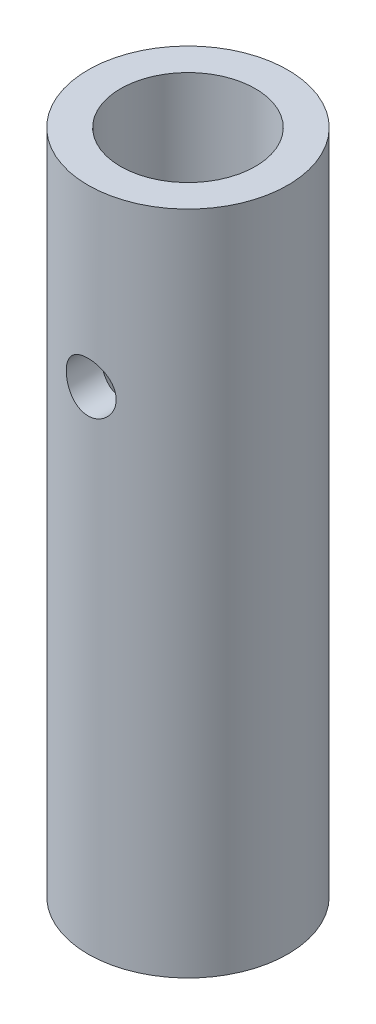
ISO-10303-21;
HEADER;
FILE_DESCRIPTION(('STEP AP214'),'2;1');
FILE_NAME('part.step','',(''),(''),'','','');
FILE_SCHEMA(('AUTOMOTIVE_DESIGN { 1 0 10303 214 1 1 1 1 }'));
ENDSEC;
DATA;
#1=APPLICATION_CONTEXT('core data for automotive mechanical design processes');
#2=APPLICATION_PROTOCOL_DEFINITION('international standard','automotive_design',2000,#1);
#3=PRODUCT_CONTEXT('',#1,'mechanical');
#4=PRODUCT('Part','Part','',(#3));
#5=PRODUCT_RELATED_PRODUCT_CATEGORY('part','',(#4));
#6=PRODUCT_DEFINITION_FORMATION('','',#4);
#7=PRODUCT_DEFINITION_CONTEXT('part definition',#1,'design');
#8=PRODUCT_DEFINITION('design','',#6,#7);
#9=PRODUCT_DEFINITION_SHAPE('','',#8);
#10=(LENGTH_UNIT() NAMED_UNIT(*) SI_UNIT(.MILLI.,.METRE.));
#11=(NAMED_UNIT(*) PLANE_ANGLE_UNIT() SI_UNIT($,.RADIAN.));
#12=(NAMED_UNIT(*) SI_UNIT($,.STERADIAN.) SOLID_ANGLE_UNIT());
#13=UNCERTAINTY_MEASURE_WITH_UNIT(LENGTH_MEASURE(1.E-05),#10,'distance_accuracy_value','');
#14=(GEOMETRIC_REPRESENTATION_CONTEXT(3) GLOBAL_UNCERTAINTY_ASSIGNED_CONTEXT((#13)) GLOBAL_UNIT_ASSIGNED_CONTEXT((#10,
#11,#12)) REPRESENTATION_CONTEXT('',''));
#15=CARTESIAN_POINT('',(0.,0.,0.));
#16=DIRECTION('',(0.,0.,1.));
#17=DIRECTION('',(1.,0.,0.));
#18=AXIS2_PLACEMENT_3D('',#15,#16,#17);
#19=CARTESIAN_POINT('',(0.,40.,0.));
#20=DIRECTION('',(0.,1.,0.));
#21=DIRECTION('',(0.,0.,1.));
#22=AXIS2_PLACEMENT_3D('',#19,#20,#21);
#23=PLANE('',#22);
#24=CARTESIAN_POINT('',(0.,40.,0.));
#25=DIRECTION('',(0.,1.,0.));
#26=DIRECTION('',(0.,0.,1.));
#27=AXIS2_PLACEMENT_3D('',#24,#25,#26);
#28=CIRCLE('',#27,6.);
#29=CARTESIAN_POINT('',(0.,40.,6.));
#30=VERTEX_POINT('',#29);
#31=EDGE_CURVE('E10',#30,#30,#28,.T.);
#32=ORIENTED_EDGE('',*,*,#31,.T.);
#33=EDGE_LOOP('',(#32));
#34=FACE_BOUND('',#33,.T.);
#35=CARTESIAN_POINT('',(0.,40.,0.));
#36=DIRECTION('',(0.,1.,0.));
#37=DIRECTION('',(0.,0.,1.));
#38=AXIS2_PLACEMENT_3D('',#35,#36,#37);
#39=CIRCLE('',#38,4.05);
#40=CARTESIAN_POINT('',(0.,40.,4.05));
#41=VERTEX_POINT('',#40);
#42=EDGE_CURVE('E64',#41,#41,#39,.T.);
#43=ORIENTED_EDGE('',*,*,#42,.F.);
#44=EDGE_LOOP('',(#43));
#45=FACE_BOUND('',#44,.T.);
#46=ADVANCED_FACE('F43',(#34,#45),#23,.T.);
#47=CARTESIAN_POINT('',(0.,0.,0.));
#48=DIRECTION('',(0.,1.,0.));
#49=DIRECTION('',(0.,0.,1.));
#50=AXIS2_PLACEMENT_3D('',#47,#48,#49);
#51=PLANE('',#50);
#52=CARTESIAN_POINT('',(0.,0.,0.));
#53=DIRECTION('',(0.,1.,0.));
#54=DIRECTION('',(0.,0.,1.));
#55=AXIS2_PLACEMENT_3D('',#52,#53,#54);
#56=CIRCLE('',#55,6.);
#57=CARTESIAN_POINT('',(0.,0.,6.));
#58=VERTEX_POINT('',#57);
#59=EDGE_CURVE('E58',#58,#58,#56,.T.);
#60=ORIENTED_EDGE('',*,*,#59,.F.);
#61=EDGE_LOOP('',(#60));
#62=FACE_BOUND('',#61,.T.);
#63=CARTESIAN_POINT('',(0.,0.,0.));
#64=DIRECTION('',(0.,1.,0.));
#65=DIRECTION('',(0.,0.,1.));
#66=AXIS2_PLACEMENT_3D('',#63,#64,#65);
#67=CIRCLE('',#66,4.05);
#68=CARTESIAN_POINT('',(0.,0.,4.05));
#69=VERTEX_POINT('',#68);
#70=EDGE_CURVE('E67',#69,#69,#67,.T.);
#71=ORIENTED_EDGE('',*,*,#70,.T.);
#72=EDGE_LOOP('',(#71));
#73=FACE_BOUND('',#72,.T.);
#74=ADVANCED_FACE('F108',(#62,#73),#51,.F.);
#75=CARTESIAN_POINT('',(0.,40.,0.));
#76=DIRECTION('',(0.,-1.,0.));
#77=DIRECTION('',(0.,0.,-1.));
#78=AXIS2_PLACEMENT_3D('',#75,#76,#77);
#79=CYLINDRICAL_SURFACE('',#78,6.);
#80=CARTESIAN_POINT('',(0.,31.,-6.));
#81=CARTESIAN_POINT('',(-0.0828760886697308,30.9999976742618,-5.99999859868013));
#82=CARTESIAN_POINT('',(-0.165778157830763,30.9931084492262,-5.99826578131828));
#83=CARTESIAN_POINT('',(-0.329206323770532,30.965774848693,-5.99152113829892));
#84=CARTESIAN_POINT('',(-0.409731046870739,30.9453227904621,-5.98650745419968));
#85=CARTESIAN_POINT('',(-0.566020872182577,30.8915607465379,-5.9737562633204));
#86=CARTESIAN_POINT('',(-0.641791563430002,30.8582662012847,-5.96602202842087));
#87=CARTESIAN_POINT('',(-0.786672131904425,30.7798186099552,-5.94865343807593));
#88=CARTESIAN_POINT('',(-0.855781784348758,30.7346651638811,-5.9390190185405));
#89=CARTESIAN_POINT('',(-0.986801927300919,30.6327992103458,-5.91867413591801));
#90=CARTESIAN_POINT('',(-1.04855569006107,30.5758884250408,-5.90794707148533));
#91=CARTESIAN_POINT('',(-1.1617489272033,30.4525477950911,-5.8867362011753));
#92=CARTESIAN_POINT('',(-1.21318723694913,30.3861168770535,-5.87625242288348));
#93=CARTESIAN_POINT('',(-1.30502654279903,30.2444047732626,-5.8565477569971));
#94=CARTESIAN_POINT('',(-1.34525221592536,30.1690067691896,-5.84734794470605));
#95=CARTESIAN_POINT('',(-1.41239690855053,30.0122515883416,-5.83149494812223));
#96=CARTESIAN_POINT('',(-1.43931805543933,29.9308953666742,-5.82484135672789));
#97=CARTESIAN_POINT('',(-1.47855483680429,29.7662565017975,-5.81500476717551));
#98=CARTESIAN_POINT('',(-1.49115226833334,29.6830451039502,-5.81175491075426));
#99=CARTESIAN_POINT('',(-1.50226177506785,29.515631430986,-5.80889362537741));
#100=CARTESIAN_POINT('',(-1.50077614181798,29.4314293193014,-5.80928160448644));
#101=CARTESIAN_POINT('',(-1.48398652463928,29.2665841922555,-5.81359205496618));
#102=CARTESIAN_POINT('',(-1.46901834019052,29.1859043785349,-5.81742863001879));
#103=CARTESIAN_POINT('',(-1.42622418690311,29.0282389490887,-5.82806709676484));
#104=CARTESIAN_POINT('',(-1.39839730206942,28.951253596971,-5.83486919970697));
#105=CARTESIAN_POINT('',(-1.33038947793715,28.8022619837479,-5.85075113904187));
#106=CARTESIAN_POINT('',(-1.29008666723291,28.7303138282104,-5.85985327469421));
#107=CARTESIAN_POINT('',(-1.19835627601495,28.5940812902432,-5.87929710846386));
#108=CARTESIAN_POINT('',(-1.14692674880884,28.5297982519327,-5.88963902334735));
#109=CARTESIAN_POINT('',(-1.03266342468122,28.4087963843056,-5.91075880539781));
#110=CARTESIAN_POINT('',(-0.969546258165858,28.3523455099387,-5.92154069477971));
#111=CARTESIAN_POINT('',(-0.834611917503699,28.2507787575361,-5.94205965578786));
#112=CARTESIAN_POINT('',(-0.762794477707944,28.2056632257364,-5.95179669549415));
#113=CARTESIAN_POINT('',(-0.612115888681392,28.1279494137756,-5.96917732094183));
#114=CARTESIAN_POINT('',(-0.533231393208624,28.0953946597456,-5.97681360127725));
#115=CARTESIAN_POINT('',(-0.370876008142882,28.0440826942904,-5.98907916991419));
#116=CARTESIAN_POINT('',(-0.287405999150484,28.0253228435819,-5.99370903339281));
#117=CARTESIAN_POINT('',(-0.120539970390026,28.0025424344412,-5.99935499271375));
#118=CARTESIAN_POINT('',(-0.0371967199882084,27.9981569739247,-6.00046053508279));
#119=CARTESIAN_POINT('',(0.12903287480151,28.0032490020555,-5.99918804814451));
#120=CARTESIAN_POINT('',(0.211919259644597,28.0127252427991,-5.99681033241847));
#121=CARTESIAN_POINT('',(0.373614268776494,28.0449709083914,-5.98889581127357));
#122=CARTESIAN_POINT('',(0.452465118968757,28.067541263477,-5.98340634185811));
#123=CARTESIAN_POINT('',(0.605257292452513,28.1251070840284,-5.96988706634134));
#124=CARTESIAN_POINT('',(0.679198119032636,28.1601038043132,-5.96185700369892));
#125=CARTESIAN_POINT('',(0.82152313442985,28.2422361288747,-5.9439330792631));
#126=CARTESIAN_POINT('',(0.889785441835834,28.2895761123968,-5.93400867366932));
#127=CARTESIAN_POINT('',(1.01752661364325,28.394789908797,-5.91344509187419));
#128=CARTESIAN_POINT('',(1.07700395897301,28.4526655396169,-5.90280579251705));
#129=CARTESIAN_POINT('',(1.18699056807273,28.5790019608445,-5.88168956960771));
#130=CARTESIAN_POINT('',(1.23724386762203,28.6476877030024,-5.87122304187281));
#131=CARTESIAN_POINT('',(1.3255107590127,28.7927326344657,-5.85192878377239));
#132=CARTESIAN_POINT('',(1.36352489415794,28.8690914829598,-5.84310098067026));
#133=CARTESIAN_POINT('',(1.42595142060929,29.0269057224131,-5.82818094734665));
#134=CARTESIAN_POINT('',(1.45044439665407,29.108327628344,-5.82207255291906));
#135=CARTESIAN_POINT('',(1.48534565995378,29.2743096378891,-5.81326744090184));
#136=CARTESIAN_POINT('',(1.49575702747866,29.3588690510325,-5.81056997719936));
#137=CARTESIAN_POINT('',(1.502038590334,29.5261210238552,-5.80894901203957));
#138=CARTESIAN_POINT('',(1.49831789778012,29.6087974351247,-5.80991932728264));
#139=CARTESIAN_POINT('',(1.47737727831287,29.772303888668,-5.81527909007843));
#140=CARTESIAN_POINT('',(1.46015762268677,29.8531339680136,-5.81966846891857));
#141=CARTESIAN_POINT('',(1.4129313194428,30.0102084590654,-5.83131260682723));
#142=CARTESIAN_POINT('',(1.38300140468038,30.0864773052402,-5.8385501523631));
#143=CARTESIAN_POINT('',(1.31126491360507,30.2329653827137,-5.85507755724829));
#144=CARTESIAN_POINT('',(1.26945669003419,30.3031837731869,-5.86436770120773));
#145=CARTESIAN_POINT('',(1.17386774863714,30.437554629002,-5.88425634263512));
#146=CARTESIAN_POINT('',(1.11980316291226,30.501501073424,-5.89488264831757));
#147=CARTESIAN_POINT('',(1.00178937118974,30.6195470447954,-5.91608027246286));
#148=CARTESIAN_POINT('',(0.937837821261147,30.673644230113,-5.9266515772706));
#149=CARTESIAN_POINT('',(0.800467586702591,30.7714113085646,-5.94677655647663));
#150=CARTESIAN_POINT('',(0.726898422316388,30.8148746136716,-5.95630833365868));
#151=CARTESIAN_POINT('',(0.573266059510478,30.8887474629405,-5.97304924975118));
#152=CARTESIAN_POINT('',(0.493207563436741,30.9191663606485,-5.98026005199781));
#153=CARTESIAN_POINT('',(0.344410253243473,30.9615718303296,-5.99048059565542));
#154=CARTESIAN_POINT('',(0.27638017090807,30.9759512430534,-5.99402585052691));
#155=CARTESIAN_POINT('',(0.138906071536284,30.9951659436219,-5.99878605231948));
#156=CARTESIAN_POINT('',(0.0694621612426168,31.0000019493053,-6.00000117450894));
#157=CARTESIAN_POINT('',(0.,31.,-6.));
#158=B_SPLINE_CURVE_WITH_KNOTS('',3,(#80,#81,#82,#83,#84,#85,#86,#87,#88,#89,#90,#91,#92,#93,
#94,#95,#96,#97,#98,#99,#100,#101,#102,#103,#104,#105,#106,#107,#108,#109,#110,#111,#112,#113,
#114,#115,#116,#117,#118,#119,#120,#121,#122,#123,#124,#125,#126,#127,#128,#129,#130,#131,#132,
#133,#134,#135,#136,#137,#138,#139,#140,#141,#142,#143,#144,#145,#146,#147,#148,#149,#150,#151,
#152,#153,#154,#155,#156,#157),.UNSPECIFIED.,.T.,.F.,(4,2,2,2,2,2,2,2,2,2,2,2,2,2,2,2,2,2,2,2,2,
2,2,2,2,2,2,2,2,2,2,2,2,2,2,2,2,2,4),(0.,0.248373712471889,0.4968882377639,0.745104902286106,
0.993329940169327,1.24614435437139,1.49898729580062,1.75558647545807,2.01214461169368,
2.2635629509943,2.51494038112697,2.76022497007018,3.00552703466038,3.25330527873879,
3.50112690836163,3.75601500969019,4.01091089558247,4.26668229009114,4.52240473688643,
4.77158308949276,5.02073901112743,5.26620274514038,5.51169127322291,5.76153587565352,
6.01142363008019,6.26744509204476,6.52345518749508,6.77792254614036,7.03233423252408,
7.27943780398613,7.52653640956035,7.77216400559448,8.01782568136901,8.2698957640991,
8.52202569770418,8.77872185499588,9.0352336382135,9.24342242942149,9.4515955604304),.UNSPECIFIED.);
#159=CARTESIAN_POINT('',(0.,31.,-6.));
#160=VERTEX_POINT('',#159);
#161=EDGE_CURVE('E94',#160,#160,#158,.T.);
#162=ORIENTED_EDGE('',*,*,#161,.T.);
#163=EDGE_LOOP('',(#162));
#164=FACE_BOUND('',#163,.T.);
#165=CARTESIAN_POINT('',(1.5,29.5,5.80947501931113));
#166=CARTESIAN_POINT('',(1.49999764715507,29.4171695494452,5.80947660051185));
#167=CARTESIAN_POINT('',(1.49311574729838,29.3343130607932,5.81126583608348));
#168=CARTESIAN_POINT('',(1.46581387527849,29.1709794530956,5.81821117195949));
#169=CARTESIAN_POINT('',(1.44538602404532,29.090503747319,5.82336923173088));
#170=CARTESIAN_POINT('',(1.39169471977917,28.9343178770878,5.8364323475758));
#171=CARTESIAN_POINT('',(1.35844783671268,28.8586017067686,5.84433385614245));
#172=CARTESIAN_POINT('',(1.28011268475685,28.713813488476,5.86198915217285));
#173=CARTESIAN_POINT('',(1.23502391313642,28.6447417227519,5.87174301827101));
#174=CARTESIAN_POINT('',(1.13322505638713,28.5136830128427,5.89224429813367));
#175=CARTESIAN_POINT('',(1.07630213262243,28.45186383979,5.90300758573818));
#176=CARTESIAN_POINT('',(0.952909238460403,28.3385431633838,5.92417725309178));
#177=CARTESIAN_POINT('',(0.886438376508189,28.287042624627,5.93458359939834));
#178=CARTESIAN_POINT('',(0.744687120647377,28.1951347194212,5.95404249312349));
#179=CARTESIAN_POINT('',(0.669296745717076,28.1548921671031,5.96307412440355));
#180=CARTESIAN_POINT('',(0.51255791057566,28.0877142135081,5.97858487155591));
#181=CARTESIAN_POINT('',(0.431210331475167,28.0607768488507,5.98506436400607));
#182=CARTESIAN_POINT('',(0.2666152552525,28.0215112992528,5.99462855308908));
#183=CARTESIAN_POINT('',(0.183439631729388,28.008898213404,5.99777936306589));
#184=CARTESIAN_POINT('',(0.0160972915576646,27.9977449724347,6.00056156464379));
#185=CARTESIAN_POINT('',(-0.068069276722838,27.9992027366742,6.00019347658022));
#186=CARTESIAN_POINT('',(-0.233028370758578,28.0159449101501,5.99602856972121));
#187=CARTESIAN_POINT('',(-0.313854323401597,28.0309217950323,5.99230801404524));
#188=CARTESIAN_POINT('',(-0.471807371120527,28.0737827620291,5.98194501914912));
#189=CARTESIAN_POINT('',(-0.548934269055654,28.1016675312264,5.97530242439065));
#190=CARTESIAN_POINT('',(-0.698110055252707,28.1698015424122,5.95972505820537));
#191=CARTESIAN_POINT('',(-0.770106764649754,28.210160226797,5.95077011817032));
#192=CARTESIAN_POINT('',(-0.906413433510731,28.3020134074698,5.9315394228579));
#193=CARTESIAN_POINT('',(-0.970722052628257,28.3535098411364,5.92126343791494));
#194=CARTESIAN_POINT('',(-1.09166105262743,28.4678252451894,5.90018228261712));
#195=CARTESIAN_POINT('',(-1.1480365186128,28.5309129354087,5.88937031715551));
#196=CARTESIAN_POINT('',(-1.24946456394453,28.6657599841242,5.86869026110024));
#197=CARTESIAN_POINT('',(-1.29451661406902,28.7375197476946,5.85882221463582));
#198=CARTESIAN_POINT('',(-1.3721821935339,28.8881740204894,5.84112298098989));
#199=CARTESIAN_POINT('',(-1.40473435045574,28.9671014381879,5.83330190235432));
#200=CARTESIAN_POINT('',(-1.45602843095451,29.1295512808459,5.82071184083974));
#201=CARTESIAN_POINT('',(-1.47477330982936,29.2130727183899,5.81594220486131));
#202=CARTESIAN_POINT('',(-1.4974977831991,29.3799757009139,5.81013213623485));
#203=CARTESIAN_POINT('',(-1.50185428435178,29.4633026759978,5.80899653456189));
#204=CARTESIAN_POINT('',(-1.49671019430933,29.6294931619469,5.81032406088624));
#205=CARTESIAN_POINT('',(-1.48721087870928,29.7123567147707,5.8127868576076));
#206=CARTESIAN_POINT('',(-1.4549552783626,29.8738685589728,5.82094249172736));
#207=CARTESIAN_POINT('',(-1.43241844096905,29.9525636359425,5.82658182140625));
#208=CARTESIAN_POINT('',(-1.37497084900237,30.105058874711,5.84040430962578));
#209=CARTESIAN_POINT('',(-1.34005862862753,30.1788584554332,5.84858776949168));
#210=CARTESIAN_POINT('',(-1.25806240076193,30.3210647667204,5.86677682255958));
#211=CARTESIAN_POINT('',(-1.21075305230138,30.3893373040259,5.87681501163985));
#212=CARTESIAN_POINT('',(-1.10559043940168,30.5171130176808,5.8975024984303));
#213=CARTESIAN_POINT('',(-1.04773544220816,30.57661474999,5.90815189637082));
#214=CARTESIAN_POINT('',(-0.921394081477089,30.6866866255426,5.92918441818964));
#215=CARTESIAN_POINT('',(-0.85267792879739,30.7369960375293,5.93955421237101));
#216=CARTESIAN_POINT('',(-0.707554024042014,30.8253615201707,5.95858329968241));
#217=CARTESIAN_POINT('',(-0.631146673436388,30.8634182299649,5.96724268202376));
#218=CARTESIAN_POINT('',(-0.473337302596637,30.9258676207168,5.98182069442989));
#219=CARTESIAN_POINT('',(-0.391976071541823,30.9503585706274,5.98775898013446));
#220=CARTESIAN_POINT('',(-0.226124640478212,30.985276200765,5.99631176037473));
#221=CARTESIAN_POINT('',(-0.141635047561866,30.9957055952434,5.99892689636045));
#222=CARTESIAN_POINT('',(0.0256252896649893,31.0020513843633,6.00051254113217));
#223=CARTESIAN_POINT('',(0.108380740449049,30.9983525636431,5.99957968320012));
#224=CARTESIAN_POINT('',(0.272051244622109,30.9774282590585,5.99438844686135));
#225=CARTESIAN_POINT('',(0.352966352671329,30.9602031774803,5.99013016735643));
#226=CARTESIAN_POINT('',(0.510256553467224,30.9129216703436,5.97878149280944));
#227=CARTESIAN_POINT('',(0.586653741871528,30.8829348200281,5.97170646753999));
#228=CARTESIAN_POINT('',(0.733375579562202,30.811044131471,5.95546933370076));
#229=CARTESIAN_POINT('',(0.803699461897577,30.7691387909956,5.94630696206604));
#230=CARTESIAN_POINT('',(0.938102892635849,30.6734271490044,5.92660874521999));
#231=CARTESIAN_POINT('',(1.00199248245088,30.6193597856389,5.91604525418417));
#232=CARTESIAN_POINT('',(1.11992253040688,30.5013657220393,5.89485973579863));
#233=CARTESIAN_POINT('',(1.17396048760229,30.4374365258531,5.88423769428834));
#234=CARTESIAN_POINT('',(1.27164303971884,30.300097878698,5.86391213790822));
#235=CARTESIAN_POINT('',(1.31507492916982,30.2265338148811,5.85422945594827));
#236=CARTESIAN_POINT('',(1.3888903449235,30.072916765116,5.83715933325924));
#237=CARTESIAN_POINT('',(1.41928336463958,29.9928685508399,5.82977022370054));
#238=CARTESIAN_POINT('',(1.46163379284816,29.8441344822599,5.81927863109675));
#239=CARTESIAN_POINT('',(1.47598975589307,29.7761602534242,5.8156299450082));
#240=CARTESIAN_POINT('',(1.4951734388599,29.6387966965001,5.81072757878358));
#241=CARTESIAN_POINT('',(1.50000197155828,29.5694074896324,5.80947369434945));
#242=CARTESIAN_POINT('',(1.5,29.5,5.80947501931113));
#243=B_SPLINE_CURVE_WITH_KNOTS('',3,(#165,#166,#167,#168,#169,#170,#171,#172,#173,#174,#175,
#176,#177,#178,#179,#180,#181,#182,#183,#184,#185,#186,#187,#188,#189,#190,#191,#192,#193,#194,
#195,#196,#197,#198,#199,#200,#201,#202,#203,#204,#205,#206,#207,#208,#209,#210,#211,#212,#213,
#214,#215,#216,#217,#218,#219,#220,#221,#222,#223,#224,#225,#226,#227,#228,#229,#230,#231,#232,
#233,#234,#235,#236,#237,#238,#239,#240,#241,#242),.UNSPECIFIED.,.T.,.F.,(4,2,2,2,2,2,2,2,2,2,2,
2,2,2,2,2,2,2,2,2,2,2,2,2,2,2,2,2,2,2,2,2,2,2,2,2,2,2,4),(0.,0.248236465041684,
0.496617444857199,0.744678436299609,0.992749960532866,1.24574372515785,1.4987611288792,
1.75530897838752,2.01181895908255,2.26313250597208,2.51440889199612,2.76010957613368,
3.00582334034872,3.25375724552667,3.50173431281348,3.75642279943147,4.01112318719881,
4.26705859205042,4.52293920077729,4.7720614485703,5.02116076310281,5.26618443005524,
5.51123712852851,5.76109707515495,6.01099811331027,6.26715198579191,6.52329249431732,
6.77755243684158,7.03176329345423,7.27910067676474,7.52643070426189,7.77242925935827,
8.01845883442843,8.27038257949243,8.52237018939305,8.77905886370806,9.03556032819972,
9.24358696306398,9.45159585059713),.UNSPECIFIED.);
#244=CARTESIAN_POINT('',(1.5,29.5,5.80947501931113));
#245=VERTEX_POINT('',#244);
#246=EDGE_CURVE('E88',#245,#245,#243,.T.);
#247=ORIENTED_EDGE('',*,*,#246,.T.);
#248=EDGE_LOOP('',(#247));
#249=FACE_BOUND('',#248,.T.);
#250=ORIENTED_EDGE('',*,*,#31,.F.);
#251=EDGE_LOOP('',(#250));
#252=FACE_BOUND('',#251,.T.);
#253=ORIENTED_EDGE('',*,*,#59,.T.);
#254=EDGE_LOOP('',(#253));
#255=FACE_BOUND('',#254,.T.);
#256=ADVANCED_FACE('F45',(#164,#249,#252,#255),#79,.T.);
#257=CARTESIAN_POINT('',(0.,40.,0.));
#258=DIRECTION('',(0.,-1.,0.));
#259=DIRECTION('',(0.,0.,-1.));
#260=AXIS2_PLACEMENT_3D('',#257,#258,#259);
#261=CYLINDRICAL_SURFACE('',#260,4.05);
#262=CARTESIAN_POINT('',(0.,31.,-4.05));
#263=CARTESIAN_POINT('',(-0.0813057928252724,31.0000025688945,-4.05000190684964));
#264=CARTESIAN_POINT('',(-0.162593778842905,30.9933685918115,-4.04753015942369));
#265=CARTESIAN_POINT('',(-0.322744321247835,30.9671122693063,-4.03791645342917));
#266=CARTESIAN_POINT('',(-0.401607159693025,30.9474914403502,-4.03077504013559));
#267=CARTESIAN_POINT('',(-0.554574882390272,30.8960478878108,-4.01258967206723));
#268=CARTESIAN_POINT('',(-0.628688495180005,30.8642483446482,-4.00155313421119));
#269=CARTESIAN_POINT('',(-0.770524841097716,30.7894664180367,-3.9766798809375));
#270=CARTESIAN_POINT('',(-0.838245899283761,30.7464811147788,-3.96284243461099));
#271=CARTESIAN_POINT('',(-0.96819083553232,30.6486796931704,-3.93315608338425));
#272=CARTESIAN_POINT('',(-1.03011349848364,30.5934804990981,-3.9172512226039));
#273=CARTESIAN_POINT('',(-1.14406405365866,30.4736314894951,-3.88550162341928));
#274=CARTESIAN_POINT('',(-1.19608902421425,30.4089788933744,-3.86965690411648));
#275=CARTESIAN_POINT('',(-1.29065950678702,30.2691423419535,-3.83917474740892));
#276=CARTESIAN_POINT('',(-1.33278350019468,30.1936574271014,-3.82460359167331));
#277=CARTESIAN_POINT('',(-1.40360481224117,30.0360494522663,-3.79918673885421));
#278=CARTESIAN_POINT('',(-1.43230734401711,29.9539289842118,-3.7883395957331));
#279=CARTESIAN_POINT('',(-1.47428861755546,29.7888443559416,-3.77219612106727));
#280=CARTESIAN_POINT('',(-1.48814111936763,29.7060468835059,-3.76669413774263));
#281=CARTESIAN_POINT('',(-1.50182316056304,29.5391338857989,-3.76126133505072));
#282=CARTESIAN_POINT('',(-1.50165831030855,29.4550189013316,-3.7613282867499));
#283=CARTESIAN_POINT('',(-1.48774983468063,29.2930646181765,-3.76684813019103));
#284=CARTESIAN_POINT('',(-1.47479635876387,29.215144813117,-3.77198760857952));
#285=CARTESIAN_POINT('',(-1.43698257056314,29.0626755226642,-3.78655348622985));
#286=CARTESIAN_POINT('',(-1.41212050986431,28.9881265339325,-3.79598051497831));
#287=CARTESIAN_POINT('',(-1.35075201746899,28.8428834720992,-3.8182519164829));
#288=CARTESIAN_POINT('',(-1.31403734476428,28.7722870503492,-3.83115666398053));
#289=CARTESIAN_POINT('',(-1.23015087973739,28.638025470514,-3.85890876329535));
#290=CARTESIAN_POINT('',(-1.18297554018298,28.5743626745808,-3.87375677337506));
#291=CARTESIAN_POINT('',(-1.07587119601217,28.4513937097285,-3.90490783560719));
#292=CARTESIAN_POINT('',(-1.01530968027132,28.3926451416234,-3.92124252553707));
#293=CARTESIAN_POINT('',(-0.88500432086272,28.2859745152926,-3.95268957320884));
#294=CARTESIAN_POINT('',(-0.815259136734218,28.2380540403288,-3.96780175199051));
#295=CARTESIAN_POINT('',(-0.667172091708014,28.153805033596,-3.99538847714597));
#296=CARTESIAN_POINT('',(-0.588718582768834,28.1176579504472,-4.00782082069767));
#297=CARTESIAN_POINT('',(-0.426269464236322,28.059258757977,-4.02833493180856));
#298=CARTESIAN_POINT('',(-0.342276270688063,28.0370006349396,-4.03641858207884));
#299=CARTESIAN_POINT('',(-0.175828141228281,28.0080733046652,-4.04699575761889));
#300=CARTESIAN_POINT('',(-0.0935207212496007,28.0006529451548,-4.04975836688583));
#301=CARTESIAN_POINT('',(0.0711998207676879,27.9994300928503,-4.05021087870637));
#302=CARTESIAN_POINT('',(0.153612916233078,28.0056246684465,-4.04790187329574));
#303=CARTESIAN_POINT('',(0.312987428278237,28.0308819254172,-4.0386482328676));
#304=CARTESIAN_POINT('',(0.390037539529894,28.0494561530011,-4.03187966703049));
#305=CARTESIAN_POINT('',(0.539876398646842,28.0983061170251,-4.01456427234243));
#306=CARTESIAN_POINT('',(0.612664590596402,28.1285833760858,-4.00401695187038));
#307=CARTESIAN_POINT('',(0.754285680034567,28.2009387184852,-3.97980740985222));
#308=CARTESIAN_POINT('',(0.822941827063079,28.2433345834184,-3.9660634721022));
#309=CARTESIAN_POINT('',(0.952392873580009,28.3383629739419,-3.93698573096534));
#310=CARTESIAN_POINT('',(1.01318490885943,28.3909992118266,-3.92165135196287));
#311=CARTESIAN_POINT('',(1.12877707743091,28.5085200802974,-3.89000724571093));
#312=CARTESIAN_POINT('',(1.183043740496,28.5739291401131,-3.87369141341579));
#313=CARTESIAN_POINT('',(1.27993140553067,28.7132505453248,-3.84276848938387));
#314=CARTESIAN_POINT('',(1.32255149653358,28.7871635552369,-3.82816153136216));
#315=CARTESIAN_POINT('',(1.39494494410103,28.9419260833874,-3.80238321758357));
#316=CARTESIAN_POINT('',(1.42467567389744,29.0227975734014,-3.79122329607762));
#317=CARTESIAN_POINT('',(1.46990891668359,29.1889257877125,-3.77391913708066));
#318=CARTESIAN_POINT('',(1.48541993882698,29.2741798571473,-3.7677719002145));
#319=CARTESIAN_POINT('',(1.50102328243792,29.4408887274639,-3.76158115853795));
#320=CARTESIAN_POINT('',(1.50202240812051,29.5222460566316,-3.76117870862021));
#321=CARTESIAN_POINT('',(1.49088624743653,29.6839038397513,-3.76560664633813));
#322=CARTESIAN_POINT('',(1.47875214429038,29.7642043882528,-3.7704365625709));
#323=CARTESIAN_POINT('',(1.44239322514254,29.919107343074,-3.7844896820656));
#324=CARTESIAN_POINT('',(1.41852966445648,29.99380749682,-3.7935812646814));
#325=CARTESIAN_POINT('',(1.3597041130553,30.1381894463558,-3.81505968346908));
#326=CARTESIAN_POINT('',(1.32473935007264,30.2078699832743,-3.82744734263428));
#327=CARTESIAN_POINT('',(1.2426137509176,30.3441332433125,-3.85491571809485));
#328=CARTESIAN_POINT('',(1.19491773712855,30.4103718397647,-3.8701022411799));
#329=CARTESIAN_POINT('',(1.089520632804,30.534195293666,-3.90108436911771));
#330=CARTESIAN_POINT('',(1.03181640252525,30.5917774248242,-3.91688016389621));
#331=CARTESIAN_POINT('',(0.904434315138626,30.6997178958048,-3.94829265287565));
#332=CARTESIAN_POINT('',(0.834288311277961,30.7495414540054,-3.9638568468105));
#333=CARTESIAN_POINT('',(0.686074814332645,30.8366712144037,-3.99217834453093));
#334=CARTESIAN_POINT('',(0.608007033135184,30.8739769611194,-4.0049355461735));
#335=CARTESIAN_POINT('',(0.443400285677821,30.9357472915975,-4.02653686412394));
#336=CARTESIAN_POINT('',(0.356666914934945,30.959748084401,-4.03523814039571));
#337=CARTESIAN_POINT('',(0.179947396111379,30.9918692840011,-4.04696731962802));
#338=CARTESIAN_POINT('',(0.0899627977419177,30.9999971575834,-4.04999789011923));
#339=CARTESIAN_POINT('',(0.,31.,-4.05));
#340=B_SPLINE_CURVE_WITH_KNOTS('',3,(#262,#263,#264,#265,#266,#267,#268,#269,#270,#271,#272,
#273,#274,#275,#276,#277,#278,#279,#280,#281,#282,#283,#284,#285,#286,#287,#288,#289,#290,#291,
#292,#293,#294,#295,#296,#297,#298,#299,#300,#301,#302,#303,#304,#305,#306,#307,#308,#309,#310,
#311,#312,#313,#314,#315,#316,#317,#318,#319,#320,#321,#322,#323,#324,#325,#326,#327,#328,#329,
#330,#331,#332,#333,#334,#335,#336,#337,#338,#339),.UNSPECIFIED.,.T.,.F.,(4,2,2,2,2,2,2,2,2,2,2,
2,2,2,2,2,2,2,2,2,2,2,2,2,2,2,2,2,2,2,2,2,2,2,2,2,2,2,4),(0.,0.243585635592386,
0.487142832866919,0.730238739798342,0.973398165602104,1.22567234768105,1.47802088261543,
1.7396979151946,2.00127322310642,2.25233104714478,2.50328838724688,2.73965281169046,
2.97605194973048,3.21685377941645,3.45773739068142,3.71438203322365,3.97106417757826,
4.23153320773398,4.49188938021996,4.73869301405964,4.98544351058737,5.22299289775759,
5.46057320165501,5.70506748748255,5.94965057200196,6.20806903353644,6.4665077021554,
6.72579465906652,6.98492635572059,7.22779068357944,7.47063313272787,7.70642518201837,
7.94227616127511,8.19026839358371,8.43833856635145,8.6993729479887,8.96041682677791,
9.23006503080961,9.49958635894827),.UNSPECIFIED.);
#341=CARTESIAN_POINT('',(0.,31.,-4.05));
#342=VERTEX_POINT('',#341);
#343=EDGE_CURVE('E48',#342,#342,#340,.T.);
#344=ORIENTED_EDGE('',*,*,#343,.F.);
#345=EDGE_LOOP('',(#344));
#346=FACE_BOUND('',#345,.T.);
#347=CARTESIAN_POINT('',(1.5,29.5,3.76198086119533));
#348=CARTESIAN_POINT('',(1.50000268526302,29.4189108665317,3.76197839280445));
#349=CARTESIAN_POINT('',(1.49340264076728,29.3378396909523,3.76463115394948));
#350=CARTESIAN_POINT('',(1.46729342623132,29.1781367569625,3.77488334160202));
#351=CARTESIAN_POINT('',(1.44778438739025,29.0995049737682,3.78248271783512));
#352=CARTESIAN_POINT('',(1.39666712891509,28.9470299848534,3.80165174920773));
#353=CARTESIAN_POINT('',(1.36508726383579,28.8731760277559,3.81321209342976));
#354=CARTESIAN_POINT('',(1.2908248804427,28.7317860930935,3.83898567457824));
#355=CARTESIAN_POINT('',(1.24813911665265,28.6642519702304,3.85319968664243));
#356=CARTESIAN_POINT('',(1.15066109488168,28.5341460237806,3.8834508721137));
#357=CARTESIAN_POINT('',(1.09541831087432,28.4719239146083,3.89954077914951));
#358=CARTESIAN_POINT('',(0.975350935608383,28.3573815586342,3.93129025761673));
#359=CARTESIAN_POINT('',(0.910524369137049,28.3050633581039,3.94694973954686));
#360=CARTESIAN_POINT('',(0.770486414268713,28.2101408628783,3.97669889097027));
#361=CARTESIAN_POINT('',(0.695002454882206,28.1679151118646,3.99071950369741));
#362=CARTESIAN_POINT('',(0.537391634691842,28.096905769219,4.01497876804958));
#363=CARTESIAN_POINT('',(0.45526702795573,28.0681176386737,4.02521869645653));
#364=CARTESIAN_POINT('',(0.290381657868036,28.0260225086337,4.04038858558274));
#365=CARTESIAN_POINT('',(0.207793810305046,28.0121137843903,4.04552428501195));
#366=CARTESIAN_POINT('',(0.0413072394312789,27.9982459913948,4.05064448004876));
#367=CARTESIAN_POINT('',(-0.0425910595962078,27.9982824975357,4.05063060972022));
#368=CARTESIAN_POINT('',(-0.205010295749702,28.0119500613124,4.0455850984626));
#369=CARTESIAN_POINT('',(-0.283595294198198,28.0249247175386,4.04079573726147));
#370=CARTESIAN_POINT('',(-0.437381552327644,28.0629982939455,4.02705356647878));
#371=CARTESIAN_POINT('',(-0.512582572712141,28.0880980700802,4.01810046296595));
#372=CARTESIAN_POINT('',(-0.658752801329338,28.1500230769083,3.99675915596456));
#373=CARTESIAN_POINT('',(-0.729645307556595,28.1870122421042,3.98432325904462));
#374=CARTESIAN_POINT('',(-0.864391370654589,28.2715222217495,3.95727903982467));
#375=CARTESIAN_POINT('',(-0.928242678334624,28.3190463869161,3.94267002684004));
#376=CARTESIAN_POINT('',(-1.05096585592654,28.4264572117511,3.91180298180388));
#377=CARTESIAN_POINT('',(-1.10934390094551,28.4868955652595,3.8954984243782));
#378=CARTESIAN_POINT('',(-1.21531903186268,28.6168074512378,3.86375039575867));
#379=CARTESIAN_POINT('',(-1.26291354531248,28.6862831333842,3.84830713069002));
#380=CARTESIAN_POINT('',(-1.34688236495765,28.8342006228061,3.81974128332706));
#381=CARTESIAN_POINT('',(-1.38299759688043,28.9128012026335,3.80667479874832));
#382=CARTESIAN_POINT('',(-1.44129459222816,29.0755794813624,3.78498994926376));
#383=CARTESIAN_POINT('',(-1.46348388054182,29.1597541410755,3.77636918256249));
#384=CARTESIAN_POINT('',(-1.49218967151314,29.3264211589988,3.7651157106558));
#385=CARTESIAN_POINT('',(-1.49948858623343,29.4087584694569,3.7621844890466));
#386=CARTESIAN_POINT('',(-1.50045904541502,29.5735155840518,3.76179811369397));
#387=CARTESIAN_POINT('',(-1.49413387646042,29.6559353635003,3.76434163925854));
#388=CARTESIAN_POINT('',(-1.46874447698623,29.8145596101631,3.77431560937444));
#389=CARTESIAN_POINT('',(-1.45027764868389,29.8908757827798,3.78151663420189));
#390=CARTESIAN_POINT('',(-1.40187668611806,30.0392939069646,3.79972440246217));
#391=CARTESIAN_POINT('',(-1.37194023753252,30.111395004635,3.81073191391822));
#392=CARTESIAN_POINT('',(-1.3002061083661,30.2522919821322,3.83581210076335));
#393=CARTESIAN_POINT('',(-1.25801174060833,30.320867931809,3.84998283895795));
#394=CARTESIAN_POINT('',(-1.16338463506486,30.4502445984843,3.87962514523604));
#395=CARTESIAN_POINT('',(-1.11094823035484,30.5110425177984,3.89509717808496));
#396=CARTESIAN_POINT('',(-0.993504126214826,30.6270183402083,3.92674995855116));
#397=CARTESIAN_POINT('',(-0.927921237045247,30.68161983984,3.94291569826283));
#398=CARTESIAN_POINT('',(-0.788126344879294,30.7791078364043,3.97321850327075));
#399=CARTESIAN_POINT('',(-0.713914363104407,30.8219943621467,3.98735557355591));
#400=CARTESIAN_POINT('',(-0.559061204061837,30.8945352892523,4.01199023462045));
#401=CARTESIAN_POINT('',(-0.478446519637071,30.9242411774028,4.02250195040793));
#402=CARTESIAN_POINT('',(-0.312887622176057,30.9695090335166,4.03875045169103));
#403=CARTESIAN_POINT('',(-0.227945406398299,30.9850774649067,4.04448941911234));
#404=CARTESIAN_POINT('',(-0.0613592363511131,31.0009443955355,4.05034387403351));
#405=CARTESIAN_POINT('',(0.0201967348630766,31.0020627132381,4.05076125919962));
#406=CARTESIAN_POINT('',(0.182283854179245,30.9910964224398,4.04670758061015));
#407=CARTESIAN_POINT('',(0.262815119710379,30.9790133408315,4.04223708219408));
#408=CARTESIAN_POINT('',(0.4186625697594,30.9425601281075,4.02904479703216));
#409=CARTESIAN_POINT('',(0.494056586231363,30.9184831987007,4.02042461503456));
#410=CARTESIAN_POINT('',(0.639743886165477,30.859015044341,3.99983077313999));
#411=CARTESIAN_POINT('',(0.71003620232468,30.8236216805872,3.9878564793705));
#412=CARTESIAN_POINT('',(0.846722267802314,30.7408497450867,3.96113788233216));
#413=CARTESIAN_POINT('',(0.912832653753189,30.6930342678474,3.94629915304809));
#414=CARTESIAN_POINT('',(1.0363464513832,30.5874702419681,3.91567902176773));
#415=CARTESIAN_POINT('',(1.09374677360272,30.5297181842499,3.89989728804132));
#416=CARTESIAN_POINT('',(1.2012302147107,30.4024043739469,3.86818412587118));
#417=CARTESIAN_POINT('',(1.25078861265519,30.332389533486,3.85228636044178));
#418=CARTESIAN_POINT('',(1.33744992968852,30.184522213396,3.82306517871813));
#419=CARTESIAN_POINT('',(1.37455213911701,30.1066692875398,3.80974190911773));
#420=CARTESIAN_POINT('',(1.43601670526684,29.942478256521,3.78701428709424));
#421=CARTESIAN_POINT('',(1.4599134543382,29.8559438757086,3.77775528078647));
#422=CARTESIAN_POINT('',(1.49189875430893,29.6795976240192,3.76524178067321));
#423=CARTESIAN_POINT('',(1.49999702668093,29.5897878033445,3.76198359437777));
#424=CARTESIAN_POINT('',(1.5,29.5,3.76198086119533));
#425=B_SPLINE_CURVE_WITH_KNOTS('',3,(#347,#348,#349,#350,#351,#352,#353,#354,#355,#356,#357,
#358,#359,#360,#361,#362,#363,#364,#365,#366,#367,#368,#369,#370,#371,#372,#373,#374,#375,#376,
#377,#378,#379,#380,#381,#382,#383,#384,#385,#386,#387,#388,#389,#390,#391,#392,#393,#394,#395,
#396,#397,#398,#399,#400,#401,#402,#403,#404,#405,#406,#407,#408,#409,#410,#411,#412,#413,#414,
#415,#416,#417,#418,#419,#420,#421,#422,#423,#424),.UNSPECIFIED.,.T.,.F.,(4,2,2,2,2,2,2,2,2,2,2,
2,2,2,2,2,2,2,2,2,2,2,2,2,2,2,2,2,2,2,2,2,2,2,2,2,2,2,4),(0.,0.242933264780764,
0.485864060573543,0.728227680714842,0.970662206472727,1.22377778926956,1.47694561197519,
1.73848739194063,1.99994076517857,2.25036705443976,2.50071387838223,2.7389744847736,
2.97725191326209,3.21896687480589,3.46075882576672,3.71638304363279,3.97206817747706,
4.23317026287089,4.49413113990897,4.74098468620362,4.98777868984589,5.22325683021158,
5.45878251003316,5.70299346281828,5.94729201048285,6.20663019986449,6.4659677514704,
6.72428315168351,6.98248039454193,7.22596012354543,7.46941169431967,7.70718414319921,
7.94500155755302,8.19270089795977,8.44048789297793,8.70095423176161,8.9614354074497,
9.23059451546758,9.49958794616565),.UNSPECIFIED.);
#426=CARTESIAN_POINT('',(1.5,29.5,3.76198086119533));
#427=VERTEX_POINT('',#426);
#428=EDGE_CURVE('E69',#427,#427,#425,.T.);
#429=ORIENTED_EDGE('',*,*,#428,.F.);
#430=EDGE_LOOP('',(#429));
#431=FACE_BOUND('',#430,.T.);
#432=ORIENTED_EDGE('',*,*,#42,.T.);
#433=EDGE_LOOP('',(#432));
#434=FACE_BOUND('',#433,.T.);
#435=ORIENTED_EDGE('',*,*,#70,.F.);
#436=EDGE_LOOP('',(#435));
#437=FACE_BOUND('',#436,.T.);
#438=ADVANCED_FACE('F75',(#346,#431,#434,#437),#261,.F.);
#439=CARTESIAN_POINT('',(0.,29.5,-6.));
#440=DIRECTION('',(0.,0.,1.));
#441=DIRECTION('',(1.,0.,0.));
#442=AXIS2_PLACEMENT_3D('',#439,#440,#441);
#443=CYLINDRICAL_SURFACE('',#442,1.5);
#444=ORIENTED_EDGE('',*,*,#428,.T.);
#445=EDGE_LOOP('',(#444));
#446=FACE_BOUND('',#445,.T.);
#447=ORIENTED_EDGE('',*,*,#246,.F.);
#448=EDGE_LOOP('',(#447));
#449=FACE_BOUND('',#448,.T.);
#450=ADVANCED_FACE('F81',(#446,#449),#443,.F.);
#451=ORIENTED_EDGE('',*,*,#343,.T.);
#452=EDGE_LOOP('',(#451));
#453=FACE_BOUND('',#452,.T.);
#454=ORIENTED_EDGE('',*,*,#161,.F.);
#455=EDGE_LOOP('',(#454));
#456=FACE_BOUND('',#455,.T.);
#457=ADVANCED_FACE('F78',(#453,#456),#443,.F.);
#458=CLOSED_SHELL('',(#46,#74,#256,#438,#450,#457));
#459=MANIFOLD_SOLID_BREP('B2',#458);
#460=ADVANCED_BREP_SHAPE_REPRESENTATION('',(#18,#459),#14);
#461=SHAPE_DEFINITION_REPRESENTATION(#9,#460);
ENDSEC;
END-ISO-10303-21;
